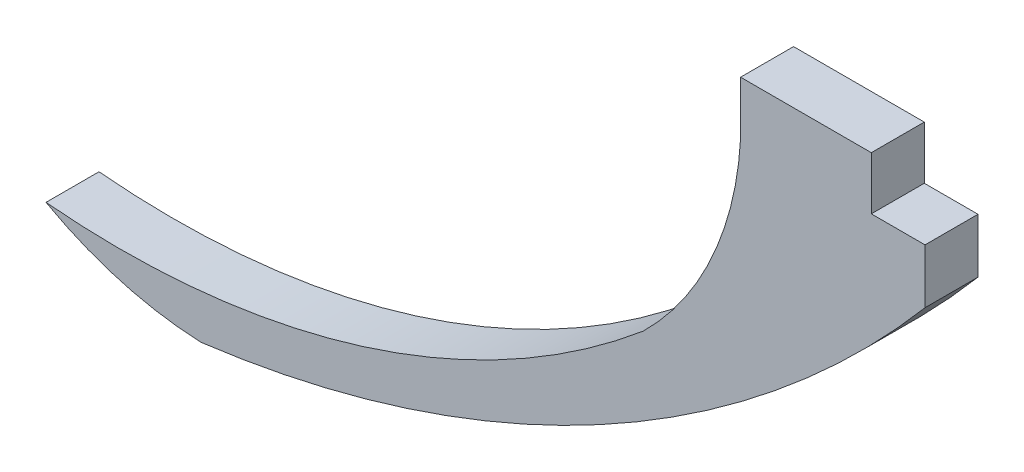
ISO-10303-21;
HEADER;
FILE_DESCRIPTION(('STEP AP214'),'2;1');
FILE_NAME('part.step','',(''),(''),'','','');
FILE_SCHEMA(('AUTOMOTIVE_DESIGN { 1 0 10303 214 1 1 1 1 }'));
ENDSEC;
DATA;
#1=APPLICATION_CONTEXT('core data for automotive mechanical design processes');
#2=APPLICATION_PROTOCOL_DEFINITION('international standard','automotive_design',2000,#1);
#3=PRODUCT_CONTEXT('',#1,'mechanical');
#4=PRODUCT('Part','Part','',(#3));
#5=PRODUCT_RELATED_PRODUCT_CATEGORY('part','',(#4));
#6=PRODUCT_DEFINITION_FORMATION('','',#4);
#7=PRODUCT_DEFINITION_CONTEXT('part definition',#1,'design');
#8=PRODUCT_DEFINITION('design','',#6,#7);
#9=PRODUCT_DEFINITION_SHAPE('','',#8);
#10=(LENGTH_UNIT() NAMED_UNIT(*) SI_UNIT(.MILLI.,.METRE.));
#11=(NAMED_UNIT(*) PLANE_ANGLE_UNIT() SI_UNIT($,.RADIAN.));
#12=(NAMED_UNIT(*) SI_UNIT($,.STERADIAN.) SOLID_ANGLE_UNIT());
#13=UNCERTAINTY_MEASURE_WITH_UNIT(LENGTH_MEASURE(1.E-05),#10,'distance_accuracy_value','');
#14=(GEOMETRIC_REPRESENTATION_CONTEXT(3) GLOBAL_UNCERTAINTY_ASSIGNED_CONTEXT((#13)) GLOBAL_UNIT_ASSIGNED_CONTEXT((#10,
#11,#12)) REPRESENTATION_CONTEXT('',''));
#15=CARTESIAN_POINT('',(0.,0.,0.));
#16=DIRECTION('',(0.,0.,1.));
#17=DIRECTION('',(1.,0.,0.));
#18=AXIS2_PLACEMENT_3D('',#15,#16,#17);
#19=CARTESIAN_POINT('',(-2.25203372430503,1.524,1.524));
#20=DIRECTION('',(0.,-1.,0.));
#21=DIRECTION('',(1.,0.,0.));
#22=AXIS2_PLACEMENT_3D('',#19,#20,#21);
#23=PLANE('',#22);
#24=DIRECTION('',(-1.,0.,0.));
#25=VECTOR('',#24,1.);
#26=CARTESIAN_POINT('',(-2.25203372430503,1.524,0.));
#27=LINE('',#26,#25);
#28=CARTESIAN_POINT('',(1.50795984157009,1.524,0.));
#29=VERTEX_POINT('',#28);
#30=CARTESIAN_POINT('',(-2.25203372430503,1.524,0.));
#31=VERTEX_POINT('',#30);
#32=EDGE_CURVE('E134',#29,#31,#27,.T.);
#33=ORIENTED_EDGE('',*,*,#32,.T.);
#34=DIRECTION('',(0.,0.,-1.));
#35=VECTOR('',#34,1.);
#36=CARTESIAN_POINT('',(-2.25203372430503,1.524,1.524));
#37=LINE('',#36,#35);
#38=CARTESIAN_POINT('',(-2.25203372430503,1.524,1.524));
#39=VERTEX_POINT('',#38);
#40=EDGE_CURVE('E11',#39,#31,#37,.T.);
#41=ORIENTED_EDGE('',*,*,#40,.F.);
#42=DIRECTION('',(-1.,0.,0.));
#43=VECTOR('',#42,1.);
#44=CARTESIAN_POINT('',(-2.25203372430503,1.524,1.524));
#45=LINE('',#44,#43);
#46=CARTESIAN_POINT('',(1.50795984157009,1.524,1.524));
#47=VERTEX_POINT('',#46);
#48=EDGE_CURVE('E150',#47,#39,#45,.T.);
#49=ORIENTED_EDGE('',*,*,#48,.F.);
#50=DIRECTION('',(0.,0.,-1.));
#51=VECTOR('',#50,1.);
#52=CARTESIAN_POINT('',(1.50795984157009,1.524,1.524));
#53=LINE('',#52,#51);
#54=EDGE_CURVE('E130',#47,#29,#53,.T.);
#55=ORIENTED_EDGE('',*,*,#54,.T.);
#56=EDGE_LOOP('',(#33,#41,#49,#55));
#57=FACE_BOUND('',#56,.T.);
#58=ADVANCED_FACE('F32',(#57),#23,.F.);
#59=CARTESIAN_POINT('',(-2.25203372430503,0.,1.524));
#60=DIRECTION('',(1.,0.,0.));
#61=DIRECTION('',(0.,1.,0.));
#62=AXIS2_PLACEMENT_3D('',#59,#60,#61);
#63=PLANE('',#62);
#64=DIRECTION('',(0.,-1.,0.));
#65=VECTOR('',#64,1.);
#66=CARTESIAN_POINT('',(-2.25203372430503,0.,0.));
#67=LINE('',#66,#65);
#68=CARTESIAN_POINT('',(-2.25203372430502,0.,0.));
#69=VERTEX_POINT('',#68);
#70=EDGE_CURVE('E137',#31,#69,#67,.T.);
#71=ORIENTED_EDGE('',*,*,#70,.T.);
#72=DIRECTION('',(0.,0.,-1.));
#73=VECTOR('',#72,1.);
#74=CARTESIAN_POINT('',(-2.25203372430502,0.,1.524));
#75=LINE('',#74,#73);
#76=CARTESIAN_POINT('',(-2.25203372430502,0.,1.524));
#77=VERTEX_POINT('',#76);
#78=EDGE_CURVE('E40',#77,#69,#75,.T.);
#79=ORIENTED_EDGE('',*,*,#78,.F.);
#80=DIRECTION('',(0.,-1.,0.));
#81=VECTOR('',#80,1.);
#82=CARTESIAN_POINT('',(-2.25203372430503,0.,1.524));
#83=LINE('',#82,#81);
#84=EDGE_CURVE('E94',#39,#77,#83,.T.);
#85=ORIENTED_EDGE('',*,*,#84,.F.);
#86=ORIENTED_EDGE('',*,*,#40,.T.);
#87=EDGE_LOOP('',(#71,#79,#85,#86));
#88=FACE_BOUND('',#87,.T.);
#89=ADVANCED_FACE('F193',(#88),#63,.F.);
#90=CARTESIAN_POINT('',(-11.6297715684799,0.501945387016467,1.524));
#91=DIRECTION('',(0.,0.,-1.));
#92=DIRECTION('',(-1.,0.,0.));
#93=AXIS2_PLACEMENT_3D('',#90,#91,#92);
#94=CYLINDRICAL_SURFACE('',#93,9.39116160257166);
#95=CARTESIAN_POINT('',(-11.6297715684799,0.501945387016467,0.));
#96=DIRECTION('',(0.,0.,-1.));
#97=DIRECTION('',(-1.,0.,0.));
#98=AXIS2_PLACEMENT_3D('',#95,#96,#97);
#99=CIRCLE('',#98,9.39116160257166);
#100=CARTESIAN_POINT('',(-5.05366894226105,-6.20244052781974,0.));
#101=VERTEX_POINT('',#100);
#102=EDGE_CURVE('E139',#69,#101,#99,.T.);
#103=ORIENTED_EDGE('',*,*,#102,.T.);
#104=DIRECTION('',(0.,0.,-1.));
#105=VECTOR('',#104,1.);
#106=CARTESIAN_POINT('',(-5.05366894226105,-6.20244052781974,1.524));
#107=LINE('',#106,#105);
#108=CARTESIAN_POINT('',(-5.05366894226105,-6.20244052781974,1.524));
#109=VERTEX_POINT('',#108);
#110=EDGE_CURVE('E160',#109,#101,#107,.T.);
#111=ORIENTED_EDGE('',*,*,#110,.F.);
#112=CARTESIAN_POINT('',(-11.6297715684799,0.501945387016467,1.524));
#113=DIRECTION('',(0.,0.,-1.));
#114=DIRECTION('',(-1.,0.,0.));
#115=AXIS2_PLACEMENT_3D('',#112,#113,#114);
#116=CIRCLE('',#115,9.39116160257166);
#117=EDGE_CURVE('E168',#77,#109,#116,.T.);
#118=ORIENTED_EDGE('',*,*,#117,.F.);
#119=ORIENTED_EDGE('',*,*,#78,.T.);
#120=EDGE_LOOP('',(#103,#111,#118,#119));
#121=FACE_BOUND('',#120,.T.);
#122=ADVANCED_FACE('F166',(#121),#94,.F.);
#123=CARTESIAN_POINT('',(-20.0848571945167,11.6812478956144,1.524));
#124=DIRECTION('',(0.,0.,-1.));
#125=DIRECTION('',(-1.,0.,0.));
#126=AXIS2_PLACEMENT_3D('',#123,#124,#125);
#127=CYLINDRICAL_SURFACE('',#126,23.3615695513213);
#128=CARTESIAN_POINT('',(-20.0848571945167,11.6812478956144,0.));
#129=DIRECTION('',(0.,0.,-1.));
#130=DIRECTION('',(1.,0.,0.));
#131=AXIS2_PLACEMENT_3D('',#128,#129,#130);
#132=CIRCLE('',#131,23.3615695513213);
#133=CARTESIAN_POINT('',(-22.2284523924117,-11.5817684936843,0.));
#134=VERTEX_POINT('',#133);
#135=EDGE_CURVE('E141',#101,#134,#132,.T.);
#136=ORIENTED_EDGE('',*,*,#135,.T.);
#137=DIRECTION('',(0.,0.,-1.));
#138=VECTOR('',#137,1.);
#139=CARTESIAN_POINT('',(-22.2284523924117,-11.5817684936843,1.524));
#140=LINE('',#139,#138);
#141=CARTESIAN_POINT('',(-22.2284523924117,-11.5817684936843,1.524));
#142=VERTEX_POINT('',#141);
#143=EDGE_CURVE('E157',#142,#134,#140,.T.);
#144=ORIENTED_EDGE('',*,*,#143,.F.);
#145=CARTESIAN_POINT('',(-20.0848571945167,11.6812478956144,1.524));
#146=DIRECTION('',(0.,0.,-1.));
#147=DIRECTION('',(1.,0.,0.));
#148=AXIS2_PLACEMENT_3D('',#145,#146,#147);
#149=CIRCLE('',#148,23.3615695513213);
#150=EDGE_CURVE('E184',#109,#142,#149,.T.);
#151=ORIENTED_EDGE('',*,*,#150,.F.);
#152=ORIENTED_EDGE('',*,*,#110,.T.);
#153=EDGE_LOOP('',(#136,#144,#151,#152));
#154=FACE_BOUND('',#153,.T.);
#155=ADVANCED_FACE('F177',(#154),#127,.F.);
#156=CARTESIAN_POINT('',(-17.355991945475,-2.83653625896488,1.524));
#157=DIRECTION('',(0.,0.,-1.));
#158=DIRECTION('',(-1.,0.,0.));
#159=AXIS2_PLACEMENT_3D('',#156,#157,#158);
#160=CYLINDRICAL_SURFACE('',#159,10.0109918412782);
#161=CARTESIAN_POINT('',(-17.355991945475,-2.83653625896488,0.));
#162=DIRECTION('',(0.,0.,1.));
#163=DIRECTION('',(1.,0.,0.));
#164=AXIS2_PLACEMENT_3D('',#161,#162,#163);
#165=CIRCLE('',#164,10.0109918412782);
#166=CARTESIAN_POINT('',(-17.7693627646887,-12.8389900685038,0.));
#167=VERTEX_POINT('',#166);
#168=EDGE_CURVE('E143',#134,#167,#165,.T.);
#169=ORIENTED_EDGE('',*,*,#168,.T.);
#170=DIRECTION('',(0.,0.,-1.));
#171=VECTOR('',#170,1.);
#172=CARTESIAN_POINT('',(-17.7693627646887,-12.8389900685038,1.524));
#173=LINE('',#172,#171);
#174=CARTESIAN_POINT('',(-17.7693627646887,-12.8389900685038,1.524));
#175=VERTEX_POINT('',#174);
#176=EDGE_CURVE('E154',#175,#167,#173,.T.);
#177=ORIENTED_EDGE('',*,*,#176,.F.);
#178=CARTESIAN_POINT('',(-17.355991945475,-2.83653625896488,1.524));
#179=DIRECTION('',(0.,0.,1.));
#180=DIRECTION('',(1.,0.,0.));
#181=AXIS2_PLACEMENT_3D('',#178,#179,#180);
#182=CIRCLE('',#181,10.0109918412782);
#183=EDGE_CURVE('E183',#142,#175,#182,.T.);
#184=ORIENTED_EDGE('',*,*,#183,.F.);
#185=ORIENTED_EDGE('',*,*,#143,.T.);
#186=EDGE_LOOP('',(#169,#177,#184,#185));
#187=FACE_BOUND('',#186,.T.);
#188=ADVANCED_FACE('F181',(#187),#160,.T.);
#189=CARTESIAN_POINT('',(-21.8570943816426,19.577647323799,1.524));
#190=DIRECTION('',(0.,0.,-1.));
#191=DIRECTION('',(-1.,0.,0.));
#192=AXIS2_PLACEMENT_3D('',#189,#190,#191);
#193=CYLINDRICAL_SURFACE('',#192,32.673351979806);
#194=CARTESIAN_POINT('',(-21.8570943816426,19.577647323799,0.));
#195=DIRECTION('',(0.,0.,1.));
#196=DIRECTION('',(-1.,0.,0.));
#197=AXIS2_PLACEMENT_3D('',#194,#195,#196);
#198=CIRCLE('',#197,32.673351979806);
#199=CARTESIAN_POINT('',(3.05240717719357,-1.56625632918406,0.));
#200=VERTEX_POINT('',#199);
#201=EDGE_CURVE('E145',#167,#200,#198,.T.);
#202=ORIENTED_EDGE('',*,*,#201,.T.);
#203=DIRECTION('',(0.,0.,-1.));
#204=VECTOR('',#203,1.);
#205=CARTESIAN_POINT('',(3.05240717719357,-1.56625632918406,1.524));
#206=LINE('',#205,#204);
#207=CARTESIAN_POINT('',(3.05240717719357,-1.56625632918406,1.524));
#208=VERTEX_POINT('',#207);
#209=EDGE_CURVE('E125',#208,#200,#206,.T.);
#210=ORIENTED_EDGE('',*,*,#209,.F.);
#211=CARTESIAN_POINT('',(-21.8570943816426,19.577647323799,1.524));
#212=DIRECTION('',(0.,0.,1.));
#213=DIRECTION('',(-1.,0.,0.));
#214=AXIS2_PLACEMENT_3D('',#211,#212,#213);
#215=CIRCLE('',#214,32.673351979806);
#216=EDGE_CURVE('E116',#175,#208,#215,.T.);
#217=ORIENTED_EDGE('',*,*,#216,.F.);
#218=ORIENTED_EDGE('',*,*,#176,.T.);
#219=EDGE_LOOP('',(#202,#210,#217,#218));
#220=FACE_BOUND('',#219,.T.);
#221=ADVANCED_FACE('F205',(#220),#193,.T.);
#222=CARTESIAN_POINT('',(3.05240717719357,0.,1.524));
#223=DIRECTION('',(-1.,0.,0.));
#224=DIRECTION('',(0.,0.,1.));
#225=AXIS2_PLACEMENT_3D('',#222,#223,#224);
#226=PLANE('',#225);
#227=DIRECTION('',(0.,1.,0.));
#228=VECTOR('',#227,1.);
#229=CARTESIAN_POINT('',(3.05240717719357,0.,0.));
#230=LINE('',#229,#228);
#231=CARTESIAN_POINT('',(3.05240717719357,0.,0.));
#232=VERTEX_POINT('',#231);
#233=EDGE_CURVE('E124',#200,#232,#230,.T.);
#234=ORIENTED_EDGE('',*,*,#233,.T.);
#235=DIRECTION('',(0.,0.,-1.));
#236=VECTOR('',#235,1.);
#237=CARTESIAN_POINT('',(3.05240717719357,0.,1.524));
#238=LINE('',#237,#236);
#239=CARTESIAN_POINT('',(3.05240717719357,0.,1.524));
#240=VERTEX_POINT('',#239);
#241=EDGE_CURVE('E121',#240,#232,#238,.T.);
#242=ORIENTED_EDGE('',*,*,#241,.F.);
#243=DIRECTION('',(0.,1.,0.));
#244=VECTOR('',#243,1.);
#245=CARTESIAN_POINT('',(3.05240717719357,0.,1.524));
#246=LINE('',#245,#244);
#247=EDGE_CURVE('E110',#208,#240,#246,.T.);
#248=ORIENTED_EDGE('',*,*,#247,.F.);
#249=ORIENTED_EDGE('',*,*,#209,.T.);
#250=EDGE_LOOP('',(#234,#242,#248,#249));
#251=FACE_BOUND('',#250,.T.);
#252=ADVANCED_FACE('F122',(#251),#226,.F.);
#253=CARTESIAN_POINT('',(1.50795984157008,0.,1.524));
#254=DIRECTION('',(0.,-1.,0.));
#255=DIRECTION('',(1.,0.,0.));
#256=AXIS2_PLACEMENT_3D('',#253,#254,#255);
#257=PLANE('',#256);
#258=DIRECTION('',(-1.,0.,0.));
#259=VECTOR('',#258,1.);
#260=CARTESIAN_POINT('',(1.50795984157008,0.,0.));
#261=LINE('',#260,#259);
#262=CARTESIAN_POINT('',(1.50795984157008,0.,0.));
#263=VERTEX_POINT('',#262);
#264=EDGE_CURVE('E80',#232,#263,#261,.T.);
#265=ORIENTED_EDGE('',*,*,#264,.T.);
#266=DIRECTION('',(0.,0.,-1.));
#267=VECTOR('',#266,1.);
#268=CARTESIAN_POINT('',(1.50795984157008,0.,1.524));
#269=LINE('',#268,#267);
#270=CARTESIAN_POINT('',(1.50795984157008,0.,1.524));
#271=VERTEX_POINT('',#270);
#272=EDGE_CURVE('E126',#271,#263,#269,.T.);
#273=ORIENTED_EDGE('',*,*,#272,.F.);
#274=DIRECTION('',(-1.,0.,0.));
#275=VECTOR('',#274,1.);
#276=CARTESIAN_POINT('',(1.50795984157008,0.,1.524));
#277=LINE('',#276,#275);
#278=EDGE_CURVE('E114',#240,#271,#277,.T.);
#279=ORIENTED_EDGE('',*,*,#278,.F.);
#280=ORIENTED_EDGE('',*,*,#241,.T.);
#281=EDGE_LOOP('',(#265,#273,#279,#280));
#282=FACE_BOUND('',#281,.T.);
#283=ADVANCED_FACE('F128',(#282),#257,.F.);
#284=CARTESIAN_POINT('',(1.50795984157009,1.524,1.524));
#285=DIRECTION('',(-1.,0.,0.));
#286=DIRECTION('',(0.,-1.,0.));
#287=AXIS2_PLACEMENT_3D('',#284,#285,#286);
#288=PLANE('',#287);
#289=DIRECTION('',(0.,1.,0.));
#290=VECTOR('',#289,1.);
#291=CARTESIAN_POINT('',(1.50795984157009,1.524,0.));
#292=LINE('',#291,#290);
#293=EDGE_CURVE('E86',#263,#29,#292,.T.);
#294=ORIENTED_EDGE('',*,*,#293,.T.);
#295=ORIENTED_EDGE('',*,*,#54,.F.);
#296=DIRECTION('',(0.,1.,0.));
#297=VECTOR('',#296,1.);
#298=CARTESIAN_POINT('',(1.50795984157009,1.524,1.524));
#299=LINE('',#298,#297);
#300=EDGE_CURVE('E48',#271,#47,#299,.T.);
#301=ORIENTED_EDGE('',*,*,#300,.F.);
#302=ORIENTED_EDGE('',*,*,#272,.T.);
#303=EDGE_LOOP('',(#294,#295,#301,#302));
#304=FACE_BOUND('',#303,.T.);
#305=ADVANCED_FACE('F213',(#304),#288,.F.);
#306=CARTESIAN_POINT('',(-21.8570943816426,19.577647323799,1.524));
#307=DIRECTION('',(0.,0.,-1.));
#308=DIRECTION('',(-1.,0.,0.));
#309=AXIS2_PLACEMENT_3D('',#306,#307,#308);
#310=PLANE('',#309);
#311=ORIENTED_EDGE('',*,*,#48,.T.);
#312=ORIENTED_EDGE('',*,*,#84,.T.);
#313=ORIENTED_EDGE('',*,*,#117,.T.);
#314=ORIENTED_EDGE('',*,*,#150,.T.);
#315=ORIENTED_EDGE('',*,*,#183,.T.);
#316=ORIENTED_EDGE('',*,*,#216,.T.);
#317=ORIENTED_EDGE('',*,*,#247,.T.);
#318=ORIENTED_EDGE('',*,*,#278,.T.);
#319=ORIENTED_EDGE('',*,*,#300,.T.);
#320=EDGE_LOOP('',(#311,#312,#313,#314,#315,#316,#317,#318,#319));
#321=FACE_BOUND('',#320,.T.);
#322=ADVANCED_FACE('F112',(#321),#310,.F.);
#323=CARTESIAN_POINT('',(-21.8570943816426,19.577647323799,0.));
#324=DIRECTION('',(0.,0.,-1.));
#325=DIRECTION('',(-1.,0.,0.));
#326=AXIS2_PLACEMENT_3D('',#323,#324,#325);
#327=PLANE('',#326);
#328=ORIENTED_EDGE('',*,*,#32,.F.);
#329=ORIENTED_EDGE('',*,*,#293,.F.);
#330=ORIENTED_EDGE('',*,*,#264,.F.);
#331=ORIENTED_EDGE('',*,*,#233,.F.);
#332=ORIENTED_EDGE('',*,*,#201,.F.);
#333=ORIENTED_EDGE('',*,*,#168,.F.);
#334=ORIENTED_EDGE('',*,*,#135,.F.);
#335=ORIENTED_EDGE('',*,*,#102,.F.);
#336=ORIENTED_EDGE('',*,*,#70,.F.);
#337=EDGE_LOOP('',(#328,#329,#330,#331,#332,#333,#334,#335,#336));
#338=FACE_BOUND('',#337,.T.);
#339=ADVANCED_FACE('F172',(#338),#327,.T.);
#340=CLOSED_SHELL('',(#58,#89,#122,#155,#188,#221,#252,#283,#305,#322,#339));
#341=MANIFOLD_SOLID_BREP('B2',#340);
#342=ADVANCED_BREP_SHAPE_REPRESENTATION('',(#18,#341),#14);
#343=SHAPE_DEFINITION_REPRESENTATION(#9,#342);
ENDSEC;
END-ISO-10303-21;
